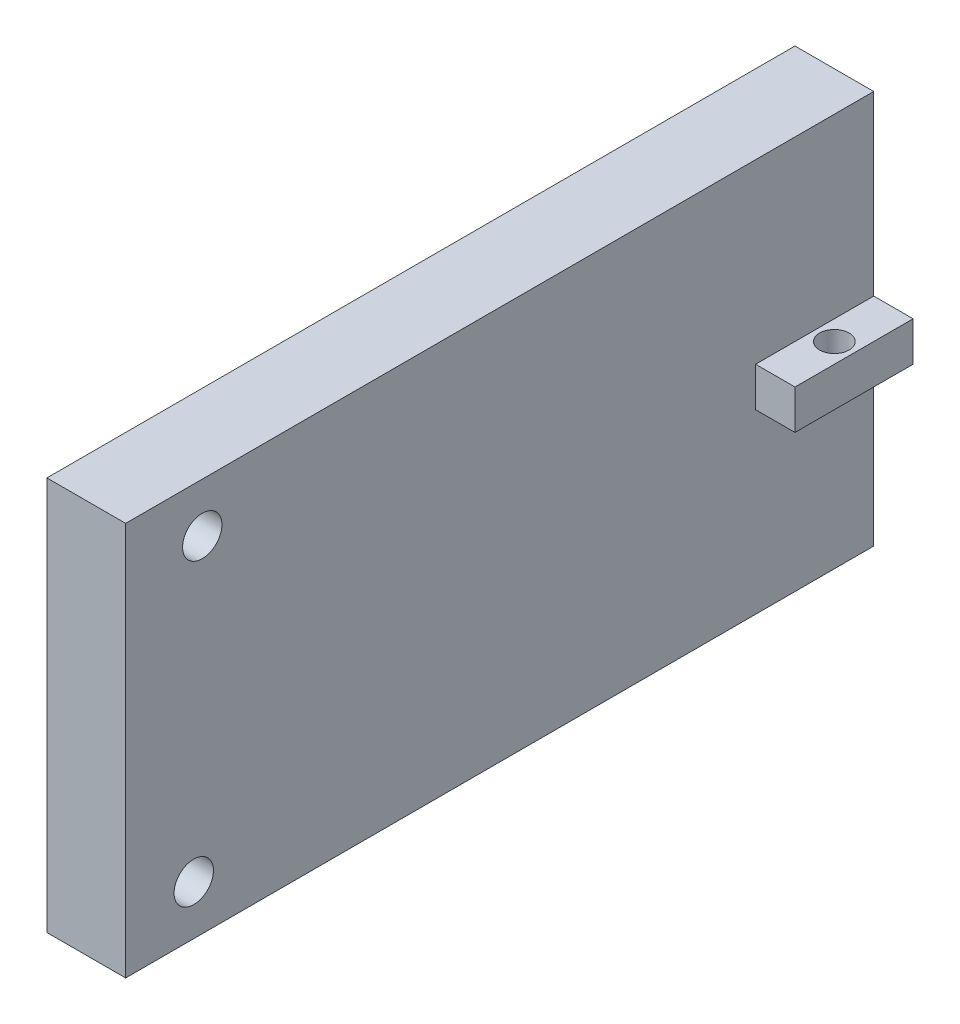
ISO-10303-21;
HEADER;
FILE_DESCRIPTION(('STEP AP214'),'2;1');
FILE_NAME('part.step','',(''),(''),'','','');
FILE_SCHEMA(('AUTOMOTIVE_DESIGN { 1 0 10303 214 1 1 1 1 }'));
ENDSEC;
DATA;
#1=APPLICATION_CONTEXT('core data for automotive mechanical design processes');
#2=APPLICATION_PROTOCOL_DEFINITION('international standard','automotive_design',2000,#1);
#3=PRODUCT_CONTEXT('',#1,'mechanical');
#4=PRODUCT('Part','Part','',(#3));
#5=PRODUCT_RELATED_PRODUCT_CATEGORY('part','',(#4));
#6=PRODUCT_DEFINITION_FORMATION('','',#4);
#7=PRODUCT_DEFINITION_CONTEXT('part definition',#1,'design');
#8=PRODUCT_DEFINITION('design','',#6,#7);
#9=PRODUCT_DEFINITION_SHAPE('','',#8);
#10=(LENGTH_UNIT() NAMED_UNIT(*) SI_UNIT(.MILLI.,.METRE.));
#11=(NAMED_UNIT(*) PLANE_ANGLE_UNIT() SI_UNIT($,.RADIAN.));
#12=(NAMED_UNIT(*) SI_UNIT($,.STERADIAN.) SOLID_ANGLE_UNIT());
#13=UNCERTAINTY_MEASURE_WITH_UNIT(LENGTH_MEASURE(1.E-05),#10,'distance_accuracy_value','');
#14=(GEOMETRIC_REPRESENTATION_CONTEXT(3) GLOBAL_UNCERTAINTY_ASSIGNED_CONTEXT((#13)) GLOBAL_UNIT_ASSIGNED_CONTEXT((#10,
#11,#12)) REPRESENTATION_CONTEXT('',''));
#15=CARTESIAN_POINT('',(0.,0.,0.));
#16=DIRECTION('',(0.,0.,1.));
#17=DIRECTION('',(1.,0.,0.));
#18=AXIS2_PLACEMENT_3D('',#15,#16,#17);
#19=CARTESIAN_POINT('',(101.6,0.,0.));
#20=DIRECTION('',(1.,0.,0.));
#21=DIRECTION('',(0.,0.,-1.));
#22=AXIS2_PLACEMENT_3D('',#19,#20,#21);
#23=PLANE('',#22);
#24=CARTESIAN_POINT('',(101.6,681.253272684369,151.21722427462));
#25=DIRECTION('',(1.,0.,0.));
#26=DIRECTION('',(0.,0.,-1.));
#27=AXIS2_PLACEMENT_3D('',#24,#25,#26);
#28=CIRCLE('',#27,25.4);
#29=CARTESIAN_POINT('',(101.6,681.253272684369,125.81722427462));
#30=VERTEX_POINT('',#29);
#31=EDGE_CURVE('E149',#30,#30,#28,.T.);
#32=ORIENTED_EDGE('',*,*,#31,.F.);
#33=EDGE_LOOP('',(#32));
#34=FACE_BOUND('',#33,.T.);
#35=CARTESIAN_POINT('',(101.6,300.253272684369,162.181898332052));
#36=DIRECTION('',(1.,0.,0.));
#37=DIRECTION('',(0.,0.,-1.));
#38=AXIS2_PLACEMENT_3D('',#35,#36,#37);
#39=CIRCLE('',#38,25.4);
#40=CARTESIAN_POINT('',(101.6,300.253272684369,136.781898332052));
#41=VERTEX_POINT('',#40);
#42=EDGE_CURVE('E156',#41,#41,#39,.T.);
#43=ORIENTED_EDGE('',*,*,#42,.F.);
#44=EDGE_LOOP('',(#43));
#45=FACE_BOUND('',#44,.T.);
#46=DIRECTION('',(0.,1.,0.));
#47=VECTOR('',#46,1.);
#48=CARTESIAN_POINT('',(101.6,0.,-562.746367735595));
#49=LINE('',#48,#47);
#50=CARTESIAN_POINT('',(101.6,465.353272684369,-562.746367735595));
#51=VERTEX_POINT('',#50);
#52=CARTESIAN_POINT('',(101.6,516.153272684369,-562.746367735595));
#53=VERTEX_POINT('',#52);
#54=EDGE_CURVE('E139',#51,#53,#49,.T.);
#55=ORIENTED_EDGE('',*,*,#54,.T.);
#56=DIRECTION('',(0.,0.,-1.));
#57=VECTOR('',#56,1.);
#58=CARTESIAN_POINT('',(101.6,516.153272684369,0.));
#59=LINE('',#58,#57);
#60=CARTESIAN_POINT('',(101.6,516.153272684369,-715.146367735595));
#61=VERTEX_POINT('',#60);
#62=EDGE_CURVE('E146',#53,#61,#59,.T.);
#63=ORIENTED_EDGE('',*,*,#62,.T.);
#64=DIRECTION('',(0.,1.,0.));
#65=VECTOR('',#64,1.);
#66=CARTESIAN_POINT('',(101.6,744.753272684369,-715.146367735595));
#67=LINE('',#66,#65);
#68=CARTESIAN_POINT('',(101.6,744.753272684369,-715.146367735595));
#69=VERTEX_POINT('',#68);
#70=EDGE_CURVE('E135',#61,#69,#67,.T.);
#71=ORIENTED_EDGE('',*,*,#70,.T.);
#72=DIRECTION('',(0.,0.,1.));
#73=VECTOR('',#72,1.);
#74=CARTESIAN_POINT('',(101.6,744.753272684369,250.053632264405));
#75=LINE('',#74,#73);
#76=CARTESIAN_POINT('',(101.6,744.753272684369,250.053632264405));
#77=VERTEX_POINT('',#76);
#78=EDGE_CURVE('E61',#69,#77,#75,.T.);
#79=ORIENTED_EDGE('',*,*,#78,.T.);
#80=DIRECTION('',(0.,-1.,0.));
#81=VECTOR('',#80,1.);
#82=CARTESIAN_POINT('',(101.6,744.753272684369,250.053632264405));
#83=LINE('',#82,#81);
#84=CARTESIAN_POINT('',(101.6,236.753272684369,250.053632264405));
#85=VERTEX_POINT('',#84);
#86=EDGE_CURVE('E161',#77,#85,#83,.T.);
#87=ORIENTED_EDGE('',*,*,#86,.T.);
#88=DIRECTION('',(0.,0.,-1.));
#89=VECTOR('',#88,1.);
#90=CARTESIAN_POINT('',(101.6,236.753272684369,250.053632264405));
#91=LINE('',#90,#89);
#92=CARTESIAN_POINT('',(101.6,236.753272684369,-715.146367735595));
#93=VERTEX_POINT('',#92);
#94=EDGE_CURVE('E89',#85,#93,#91,.T.);
#95=ORIENTED_EDGE('',*,*,#94,.T.);
#96=CARTESIAN_POINT('',(101.6,465.353272684369,-715.146367735595));
#97=VERTEX_POINT('',#96);
#98=EDGE_CURVE('E164',#93,#97,#67,.T.);
#99=ORIENTED_EDGE('',*,*,#98,.T.);
#100=DIRECTION('',(0.,0.,1.));
#101=VECTOR('',#100,1.);
#102=CARTESIAN_POINT('',(101.6,465.353272684369,0.));
#103=LINE('',#102,#101);
#104=EDGE_CURVE('E136',#97,#51,#103,.T.);
#105=ORIENTED_EDGE('',*,*,#104,.T.);
#106=EDGE_LOOP('',(#55,#63,#71,#79,#87,#95,#99,#105));
#107=FACE_BOUND('',#106,.T.);
#108=ADVANCED_FACE('F36',(#34,#45,#107),#23,.T.);
#109=CARTESIAN_POINT('',(101.6,744.753272684369,250.053632264405));
#110=DIRECTION('',(0.,0.,-1.));
#111=DIRECTION('',(-1.,0.,0.));
#112=AXIS2_PLACEMENT_3D('',#109,#110,#111);
#113=PLANE('',#112);
#114=DIRECTION('',(0.,-1.,0.));
#115=VECTOR('',#114,1.);
#116=CARTESIAN_POINT('',(0.,744.753272684369,250.053632264405));
#117=LINE('',#116,#115);
#118=CARTESIAN_POINT('',(0.,744.753272684369,250.053632264405));
#119=VERTEX_POINT('',#118);
#120=CARTESIAN_POINT('',(0.,236.753272684369,250.053632264405));
#121=VERTEX_POINT('',#120);
#122=EDGE_CURVE('E152',#119,#121,#117,.T.);
#123=ORIENTED_EDGE('',*,*,#122,.T.);
#124=DIRECTION('',(-1.,0.,0.));
#125=VECTOR('',#124,1.);
#126=CARTESIAN_POINT('',(101.6,236.753272684369,250.053632264405));
#127=LINE('',#126,#125);
#128=EDGE_CURVE('E11',#85,#121,#127,.T.);
#129=ORIENTED_EDGE('',*,*,#128,.F.);
#130=ORIENTED_EDGE('',*,*,#86,.F.);
#131=DIRECTION('',(-1.,0.,0.));
#132=VECTOR('',#131,1.);
#133=CARTESIAN_POINT('',(101.6,744.753272684369,250.053632264405));
#134=LINE('',#133,#132);
#135=EDGE_CURVE('E168',#77,#119,#134,.T.);
#136=ORIENTED_EDGE('',*,*,#135,.T.);
#137=EDGE_LOOP('',(#123,#129,#130,#136));
#138=FACE_BOUND('',#137,.T.);
#139=ADVANCED_FACE('F38',(#138),#113,.F.);
#140=CARTESIAN_POINT('',(101.6,236.753272684369,250.053632264405));
#141=DIRECTION('',(0.,1.,0.));
#142=DIRECTION('',(0.,0.,1.));
#143=AXIS2_PLACEMENT_3D('',#140,#141,#142);
#144=PLANE('',#143);
#145=DIRECTION('',(0.,0.,-1.));
#146=VECTOR('',#145,1.);
#147=CARTESIAN_POINT('',(0.,236.753272684369,250.053632264405));
#148=LINE('',#147,#146);
#149=CARTESIAN_POINT('',(0.,236.753272684369,-715.146367735595));
#150=VERTEX_POINT('',#149);
#151=EDGE_CURVE('E171',#121,#150,#148,.T.);
#152=ORIENTED_EDGE('',*,*,#151,.T.);
#153=DIRECTION('',(-1.,0.,0.));
#154=VECTOR('',#153,1.);
#155=CARTESIAN_POINT('',(101.6,236.753272684369,-715.146367735595));
#156=LINE('',#155,#154);
#157=EDGE_CURVE('E45',#93,#150,#156,.T.);
#158=ORIENTED_EDGE('',*,*,#157,.F.);
#159=ORIENTED_EDGE('',*,*,#94,.F.);
#160=ORIENTED_EDGE('',*,*,#128,.T.);
#161=EDGE_LOOP('',(#152,#158,#159,#160));
#162=FACE_BOUND('',#161,.T.);
#163=ADVANCED_FACE('F198',(#162),#144,.F.);
#164=CARTESIAN_POINT('',(101.6,744.753272684369,-715.146367735595));
#165=DIRECTION('',(0.,0.,1.));
#166=DIRECTION('',(0.,-1.,0.));
#167=AXIS2_PLACEMENT_3D('',#164,#165,#166);
#168=PLANE('',#167);
#169=DIRECTION('',(0.,1.,0.));
#170=VECTOR('',#169,1.);
#171=CARTESIAN_POINT('',(0.,744.753272684369,-715.146367735595));
#172=LINE('',#171,#170);
#173=CARTESIAN_POINT('',(0.,744.753272684369,-715.146367735595));
#174=VERTEX_POINT('',#173);
#175=EDGE_CURVE('E173',#150,#174,#172,.T.);
#176=ORIENTED_EDGE('',*,*,#175,.T.);
#177=DIRECTION('',(-1.,0.,0.));
#178=VECTOR('',#177,1.);
#179=CARTESIAN_POINT('',(101.6,744.753272684369,-715.146367735595));
#180=LINE('',#179,#178);
#181=EDGE_CURVE('E177',#69,#174,#180,.T.);
#182=ORIENTED_EDGE('',*,*,#181,.F.);
#183=ORIENTED_EDGE('',*,*,#70,.F.);
#184=DIRECTION('',(-1.,0.,0.));
#185=VECTOR('',#184,1.);
#186=CARTESIAN_POINT('',(152.4,516.153272684369,-715.146367735595));
#187=LINE('',#186,#185);
#188=CARTESIAN_POINT('',(152.4,516.153272684369,-715.146367735595));
#189=VERTEX_POINT('',#188);
#190=EDGE_CURVE('E115',#189,#61,#187,.T.);
#191=ORIENTED_EDGE('',*,*,#190,.F.);
#192=DIRECTION('',(0.,1.,0.));
#193=VECTOR('',#192,1.);
#194=CARTESIAN_POINT('',(152.4,516.153272684369,-715.146367735595));
#195=LINE('',#194,#193);
#196=CARTESIAN_POINT('',(152.4,465.353272684369,-715.146367735595));
#197=VERTEX_POINT('',#196);
#198=EDGE_CURVE('E122',#197,#189,#195,.T.);
#199=ORIENTED_EDGE('',*,*,#198,.F.);
#200=DIRECTION('',(-1.,0.,0.));
#201=VECTOR('',#200,1.);
#202=CARTESIAN_POINT('',(152.4,465.353272684369,-715.146367735595));
#203=LINE('',#202,#201);
#204=EDGE_CURVE('E243',#197,#97,#203,.T.);
#205=ORIENTED_EDGE('',*,*,#204,.T.);
#206=ORIENTED_EDGE('',*,*,#98,.F.);
#207=ORIENTED_EDGE('',*,*,#157,.T.);
#208=EDGE_LOOP('',(#176,#182,#183,#191,#199,#205,#206,#207));
#209=FACE_BOUND('',#208,.T.);
#210=ADVANCED_FACE('F133',(#209),#168,.F.);
#211=CARTESIAN_POINT('',(101.6,744.753272684369,250.053632264405));
#212=DIRECTION('',(0.,-1.,0.));
#213=DIRECTION('',(0.,0.,-1.));
#214=AXIS2_PLACEMENT_3D('',#211,#212,#213);
#215=PLANE('',#214);
#216=DIRECTION('',(0.,0.,1.));
#217=VECTOR('',#216,1.);
#218=CARTESIAN_POINT('',(0.,744.753272684369,250.053632264405));
#219=LINE('',#218,#217);
#220=EDGE_CURVE('E82',#174,#119,#219,.T.);
#221=ORIENTED_EDGE('',*,*,#220,.T.);
#222=ORIENTED_EDGE('',*,*,#135,.F.);
#223=ORIENTED_EDGE('',*,*,#78,.F.);
#224=ORIENTED_EDGE('',*,*,#181,.T.);
#225=EDGE_LOOP('',(#221,#222,#223,#224));
#226=FACE_BOUND('',#225,.T.);
#227=ADVANCED_FACE('F189',(#226),#215,.F.);
#228=CARTESIAN_POINT('',(0.,0.,0.));
#229=DIRECTION('',(1.,0.,0.));
#230=DIRECTION('',(0.,0.,-1.));
#231=AXIS2_PLACEMENT_3D('',#228,#229,#230);
#232=PLANE('',#231);
#233=ORIENTED_EDGE('',*,*,#220,.F.);
#234=ORIENTED_EDGE('',*,*,#175,.F.);
#235=ORIENTED_EDGE('',*,*,#151,.F.);
#236=ORIENTED_EDGE('',*,*,#122,.F.);
#237=EDGE_LOOP('',(#233,#234,#235,#236));
#238=FACE_BOUND('',#237,.T.);
#239=CARTESIAN_POINT('',(0.,300.253272684369,162.181898332052));
#240=DIRECTION('',(1.,0.,0.));
#241=DIRECTION('',(0.,0.,-1.));
#242=AXIS2_PLACEMENT_3D('',#239,#240,#241);
#243=CIRCLE('',#242,25.4);
#244=CARTESIAN_POINT('',(0.,300.253272684369,136.781898332052));
#245=VERTEX_POINT('',#244);
#246=EDGE_CURVE('E148',#245,#245,#243,.T.);
#247=ORIENTED_EDGE('',*,*,#246,.T.);
#248=EDGE_LOOP('',(#247));
#249=FACE_BOUND('',#248,.T.);
#250=CARTESIAN_POINT('',(0.,681.253272684369,151.21722427462));
#251=DIRECTION('',(1.,0.,0.));
#252=DIRECTION('',(0.,0.,-1.));
#253=AXIS2_PLACEMENT_3D('',#250,#251,#252);
#254=CIRCLE('',#253,25.4);
#255=CARTESIAN_POINT('',(0.,681.253272684369,125.81722427462));
#256=VERTEX_POINT('',#255);
#257=EDGE_CURVE('E153',#256,#256,#254,.T.);
#258=ORIENTED_EDGE('',*,*,#257,.T.);
#259=EDGE_LOOP('',(#258));
#260=FACE_BOUND('',#259,.T.);
#261=ADVANCED_FACE('F183',(#238,#249,#260),#232,.F.);
#262=CARTESIAN_POINT('',(101.6,300.253272684369,162.181898332052));
#263=DIRECTION('',(-1.,0.,0.));
#264=DIRECTION('',(0.,0.,1.));
#265=AXIS2_PLACEMENT_3D('',#262,#263,#264);
#266=CYLINDRICAL_SURFACE('',#265,25.4);
#267=ORIENTED_EDGE('',*,*,#42,.T.);
#268=EDGE_LOOP('',(#267));
#269=FACE_BOUND('',#268,.T.);
#270=ORIENTED_EDGE('',*,*,#246,.F.);
#271=EDGE_LOOP('',(#270));
#272=FACE_BOUND('',#271,.T.);
#273=ADVANCED_FACE('F196',(#269,#272),#266,.F.);
#274=CARTESIAN_POINT('',(101.6,681.253272684369,151.21722427462));
#275=DIRECTION('',(-1.,0.,0.));
#276=DIRECTION('',(0.,0.,1.));
#277=AXIS2_PLACEMENT_3D('',#274,#275,#276);
#278=CYLINDRICAL_SURFACE('',#277,25.4);
#279=ORIENTED_EDGE('',*,*,#31,.T.);
#280=EDGE_LOOP('',(#279));
#281=FACE_BOUND('',#280,.T.);
#282=ORIENTED_EDGE('',*,*,#257,.F.);
#283=EDGE_LOOP('',(#282));
#284=FACE_BOUND('',#283,.T.);
#285=ADVANCED_FACE('F211',(#281,#284),#278,.F.);
#286=CARTESIAN_POINT('',(152.4,516.153272684369,-715.146367735595));
#287=DIRECTION('',(0.,-1.,0.));
#288=DIRECTION('',(0.,0.,-1.));
#289=AXIS2_PLACEMENT_3D('',#286,#287,#288);
#290=PLANE('',#289);
#291=CARTESIAN_POINT('',(127.,516.153272684369,-638.946367735595));
#292=DIRECTION('',(0.,-1.,0.));
#293=DIRECTION('',(0.,0.,-1.));
#294=AXIS2_PLACEMENT_3D('',#291,#292,#293);
#295=CIRCLE('',#294,19.05);
#296=CARTESIAN_POINT('',(127.,516.153272684369,-657.996367735595));
#297=VERTEX_POINT('',#296);
#298=EDGE_CURVE('E130',#297,#297,#295,.F.);
#299=ORIENTED_EDGE('',*,*,#298,.F.);
#300=EDGE_LOOP('',(#299));
#301=FACE_BOUND('',#300,.T.);
#302=ORIENTED_EDGE('',*,*,#62,.F.);
#303=DIRECTION('',(-1.,0.,0.));
#304=VECTOR('',#303,1.);
#305=CARTESIAN_POINT('',(152.4,516.153272684369,-562.746367735595));
#306=LINE('',#305,#304);
#307=CARTESIAN_POINT('',(152.4,516.153272684369,-562.746367735595));
#308=VERTEX_POINT('',#307);
#309=EDGE_CURVE('E118',#308,#53,#306,.T.);
#310=ORIENTED_EDGE('',*,*,#309,.F.);
#311=DIRECTION('',(0.,0.,1.));
#312=VECTOR('',#311,1.);
#313=CARTESIAN_POINT('',(152.4,516.153272684369,-715.146367735595));
#314=LINE('',#313,#312);
#315=EDGE_CURVE('E111',#189,#308,#314,.T.);
#316=ORIENTED_EDGE('',*,*,#315,.F.);
#317=ORIENTED_EDGE('',*,*,#190,.T.);
#318=EDGE_LOOP('',(#302,#310,#316,#317));
#319=FACE_BOUND('',#318,.T.);
#320=ADVANCED_FACE('F113',(#301,#319),#290,.F.);
#321=CARTESIAN_POINT('',(152.4,516.153272684369,-562.746367735595));
#322=DIRECTION('',(0.,0.,-1.));
#323=DIRECTION('',(-1.,0.,0.));
#324=AXIS2_PLACEMENT_3D('',#321,#322,#323);
#325=PLANE('',#324);
#326=ORIENTED_EDGE('',*,*,#54,.F.);
#327=DIRECTION('',(-1.,0.,0.));
#328=VECTOR('',#327,1.);
#329=CARTESIAN_POINT('',(152.4,465.353272684369,-562.746367735595));
#330=LINE('',#329,#328);
#331=CARTESIAN_POINT('',(152.4,465.353272684369,-562.746367735595));
#332=VERTEX_POINT('',#331);
#333=EDGE_CURVE('E52',#332,#51,#330,.T.);
#334=ORIENTED_EDGE('',*,*,#333,.F.);
#335=DIRECTION('',(0.,-1.,0.));
#336=VECTOR('',#335,1.);
#337=CARTESIAN_POINT('',(152.4,516.153272684369,-562.746367735595));
#338=LINE('',#337,#336);
#339=EDGE_CURVE('E121',#308,#332,#338,.T.);
#340=ORIENTED_EDGE('',*,*,#339,.F.);
#341=ORIENTED_EDGE('',*,*,#309,.T.);
#342=EDGE_LOOP('',(#326,#334,#340,#341));
#343=FACE_BOUND('',#342,.T.);
#344=ADVANCED_FACE('F218',(#343),#325,.F.);
#345=CARTESIAN_POINT('',(152.4,465.353272684369,-715.146367735595));
#346=DIRECTION('',(0.,1.,0.));
#347=DIRECTION('',(0.,0.,1.));
#348=AXIS2_PLACEMENT_3D('',#345,#346,#347);
#349=PLANE('',#348);
#350=CARTESIAN_POINT('',(127.,465.353272684369,-638.946367735595));
#351=DIRECTION('',(0.,1.,0.));
#352=DIRECTION('',(0.,0.,1.));
#353=AXIS2_PLACEMENT_3D('',#350,#351,#352);
#354=CIRCLE('',#353,19.05);
#355=CARTESIAN_POINT('',(127.,465.353272684369,-657.996367735595));
#356=VERTEX_POINT('',#355);
#357=EDGE_CURVE('E40',#356,#356,#354,.F.);
#358=ORIENTED_EDGE('',*,*,#357,.F.);
#359=EDGE_LOOP('',(#358));
#360=FACE_BOUND('',#359,.T.);
#361=ORIENTED_EDGE('',*,*,#104,.F.);
#362=ORIENTED_EDGE('',*,*,#204,.F.);
#363=DIRECTION('',(0.,0.,-1.));
#364=VECTOR('',#363,1.);
#365=CARTESIAN_POINT('',(152.4,465.353272684369,-715.146367735595));
#366=LINE('',#365,#364);
#367=EDGE_CURVE('E126',#332,#197,#366,.T.);
#368=ORIENTED_EDGE('',*,*,#367,.F.);
#369=ORIENTED_EDGE('',*,*,#333,.T.);
#370=EDGE_LOOP('',(#361,#362,#368,#369));
#371=FACE_BOUND('',#370,.T.);
#372=ADVANCED_FACE('F222',(#360,#371),#349,.F.);
#373=CARTESIAN_POINT('',(152.4,0.,0.));
#374=DIRECTION('',(-1.,0.,0.));
#375=DIRECTION('',(0.,0.,1.));
#376=AXIS2_PLACEMENT_3D('',#373,#374,#375);
#377=PLANE('',#376);
#378=ORIENTED_EDGE('',*,*,#198,.T.);
#379=ORIENTED_EDGE('',*,*,#315,.T.);
#380=ORIENTED_EDGE('',*,*,#339,.T.);
#381=ORIENTED_EDGE('',*,*,#367,.T.);
#382=EDGE_LOOP('',(#378,#379,#380,#381));
#383=FACE_BOUND('',#382,.T.);
#384=ADVANCED_FACE('F125',(#383),#377,.F.);
#385=CARTESIAN_POINT('',(127.,609.6,-638.946367735595));
#386=DIRECTION('',(0.,-1.,0.));
#387=DIRECTION('',(0.,0.,-1.));
#388=AXIS2_PLACEMENT_3D('',#385,#386,#387);
#389=CYLINDRICAL_SURFACE('',#388,19.05);
#390=CARTESIAN_POINT('',(127.,465.353272684369,-657.996367735595));
#391=CARTESIAN_POINT('',(127.,465.882439351036,-657.996367735595));
#392=CARTESIAN_POINT('',(127.,466.411606017702,-657.996367735595));
#393=CARTESIAN_POINT('',(127.,467.469939351036,-657.996367735595));
#394=CARTESIAN_POINT('',(127.,467.999106017702,-657.996367735595));
#395=CARTESIAN_POINT('',(127.,469.057439351036,-657.996367735595));
#396=CARTESIAN_POINT('',(127.,469.586606017702,-657.996367735595));
#397=CARTESIAN_POINT('',(127.,470.644939351036,-657.996367735595));
#398=CARTESIAN_POINT('',(127.,471.174106017702,-657.996367735595));
#399=CARTESIAN_POINT('',(127.,472.232439351036,-657.996367735595));
#400=CARTESIAN_POINT('',(127.,472.761606017702,-657.996367735595));
#401=CARTESIAN_POINT('',(127.,473.819939351036,-657.996367735595));
#402=CARTESIAN_POINT('',(127.,474.349106017702,-657.996367735595));
#403=CARTESIAN_POINT('',(127.,475.407439351036,-657.996367735595));
#404=CARTESIAN_POINT('',(127.,475.936606017702,-657.996367735595));
#405=CARTESIAN_POINT('',(127.,476.994939351036,-657.996367735595));
#406=CARTESIAN_POINT('',(127.,477.524106017702,-657.996367735595));
#407=CARTESIAN_POINT('',(127.,478.582439351036,-657.996367735595));
#408=CARTESIAN_POINT('',(127.,479.111606017702,-657.996367735595));
#409=CARTESIAN_POINT('',(127.,480.169939351036,-657.996367735595));
#410=CARTESIAN_POINT('',(127.,480.699106017702,-657.996367735595));
#411=CARTESIAN_POINT('',(127.,481.757439351036,-657.996367735595));
#412=CARTESIAN_POINT('',(127.,482.286606017702,-657.996367735595));
#413=CARTESIAN_POINT('',(127.,483.344939351036,-657.996367735595));
#414=CARTESIAN_POINT('',(127.,483.874106017702,-657.996367735595));
#415=CARTESIAN_POINT('',(127.,484.932439351036,-657.996367735595));
#416=CARTESIAN_POINT('',(127.,485.461606017702,-657.996367735595));
#417=CARTESIAN_POINT('',(127.,486.519939351036,-657.996367735595));
#418=CARTESIAN_POINT('',(127.,487.049106017702,-657.996367735595));
#419=CARTESIAN_POINT('',(127.,488.107439351036,-657.996367735595));
#420=CARTESIAN_POINT('',(127.,488.636606017702,-657.996367735595));
#421=CARTESIAN_POINT('',(127.,489.694939351036,-657.996367735595));
#422=CARTESIAN_POINT('',(127.,490.224106017702,-657.996367735595));
#423=CARTESIAN_POINT('',(127.,491.282439351036,-657.996367735595));
#424=CARTESIAN_POINT('',(127.,491.811606017702,-657.996367735595));
#425=CARTESIAN_POINT('',(127.,492.869939351036,-657.996367735595));
#426=CARTESIAN_POINT('',(127.,493.399106017702,-657.996367735595));
#427=CARTESIAN_POINT('',(127.,494.457439351036,-657.996367735595));
#428=CARTESIAN_POINT('',(127.,494.986606017702,-657.996367735595));
#429=CARTESIAN_POINT('',(127.,496.044939351036,-657.996367735595));
#430=CARTESIAN_POINT('',(127.,496.574106017702,-657.996367735595));
#431=CARTESIAN_POINT('',(127.,497.632439351036,-657.996367735595));
#432=CARTESIAN_POINT('',(127.,498.161606017702,-657.996367735595));
#433=CARTESIAN_POINT('',(127.,499.219939351036,-657.996367735595));
#434=CARTESIAN_POINT('',(127.,499.749106017702,-657.996367735595));
#435=CARTESIAN_POINT('',(127.,500.807439351036,-657.996367735595));
#436=CARTESIAN_POINT('',(127.,501.336606017702,-657.996367735595));
#437=CARTESIAN_POINT('',(127.,502.394939351036,-657.996367735595));
#438=CARTESIAN_POINT('',(127.,502.924106017702,-657.996367735595));
#439=CARTESIAN_POINT('',(127.,503.982439351036,-657.996367735595));
#440=CARTESIAN_POINT('',(127.,504.511606017702,-657.996367735595));
#441=CARTESIAN_POINT('',(127.,505.569939351036,-657.996367735595));
#442=CARTESIAN_POINT('',(127.,506.099106017702,-657.996367735595));
#443=CARTESIAN_POINT('',(127.,507.157439351036,-657.996367735595));
#444=CARTESIAN_POINT('',(127.,507.686606017702,-657.996367735595));
#445=CARTESIAN_POINT('',(127.,508.744939351036,-657.996367735595));
#446=CARTESIAN_POINT('',(127.,509.274106017702,-657.996367735595));
#447=CARTESIAN_POINT('',(127.,510.332439351036,-657.996367735595));
#448=CARTESIAN_POINT('',(127.,510.861606017702,-657.996367735595));
#449=CARTESIAN_POINT('',(127.,511.919939351036,-657.996367735595));
#450=CARTESIAN_POINT('',(127.,512.449106017702,-657.996367735595));
#451=CARTESIAN_POINT('',(127.,513.507439351036,-657.996367735595));
#452=CARTESIAN_POINT('',(127.,514.036606017702,-657.996367735595));
#453=CARTESIAN_POINT('',(127.,515.094939351036,-657.996367735595));
#454=CARTESIAN_POINT('',(127.,515.624106017702,-657.996367735595));
#455=CARTESIAN_POINT('',(127.,516.153272684369,-657.996367735595));
#456=B_SPLINE_CURVE_WITH_KNOTS('',3,(#390,#391,#392,#393,#394,#395,#396,#397,#398,#399,#400,
#401,#402,#403,#404,#405,#406,#407,#408,#409,#410,#411,#412,#413,#414,#415,#416,#417,#418,#419,
#420,#421,#422,#423,#424,#425,#426,#427,#428,#429,#430,#431,#432,#433,#434,#435,#436,#437,#438,
#439,#440,#441,#442,#443,#444,#445,#446,#447,#448,#449,#450,#451,#452,#453,#454,#455),
.UNSPECIFIED.,.F.,.F.,(4,2,2,2,2,2,2,2,2,2,2,2,2,2,2,2,2,2,2,2,2,2,2,2,2,2,2,2,2,2,2,2,4),(0.,
1.58749999999996,3.17499999999998,4.7625,6.34999999999997,7.93749999999999,9.52500000000001,
11.1125,12.7,14.2875,15.875,17.4625,19.05,20.6375,22.2250000000001,23.8125,25.4,
26.9875000000001,28.575,30.1625,31.7500000000001,33.3375000000001,34.9250000000001,
36.5125000000001,38.1,39.6875000000001,41.2750000000001,42.8625000000001,44.4500000000001,
46.0375000000001,47.6250000000001,49.2125000000001,50.8000000000001),.UNSPECIFIED.);
#457=EDGE_CURVE('BSEAM229',#356,#297,#456,.T.);
#458=ORIENTED_EDGE('',*,*,#357,.T.);
#459=ORIENTED_EDGE('',*,*,#298,.T.);
#460=ORIENTED_EDGE('',*,*,#457,.T.);
#461=ORIENTED_EDGE('',*,*,#457,.F.);
#462=EDGE_LOOP('',(#458,#460,#459,#461));
#463=FACE_BOUND('',#462,.T.);
#464=ADVANCED_FACE('F229',(#463),#389,.F.);
#465=CLOSED_SHELL('',(#108,#139,#163,#210,#227,#261,#273,#285,#320,#344,#372,#384,#464));
#466=MANIFOLD_SOLID_BREP('B2',#465);
#467=ADVANCED_BREP_SHAPE_REPRESENTATION('',(#18,#466),#14);
#468=SHAPE_DEFINITION_REPRESENTATION(#9,#467);
ENDSEC;
END-ISO-10303-21;
